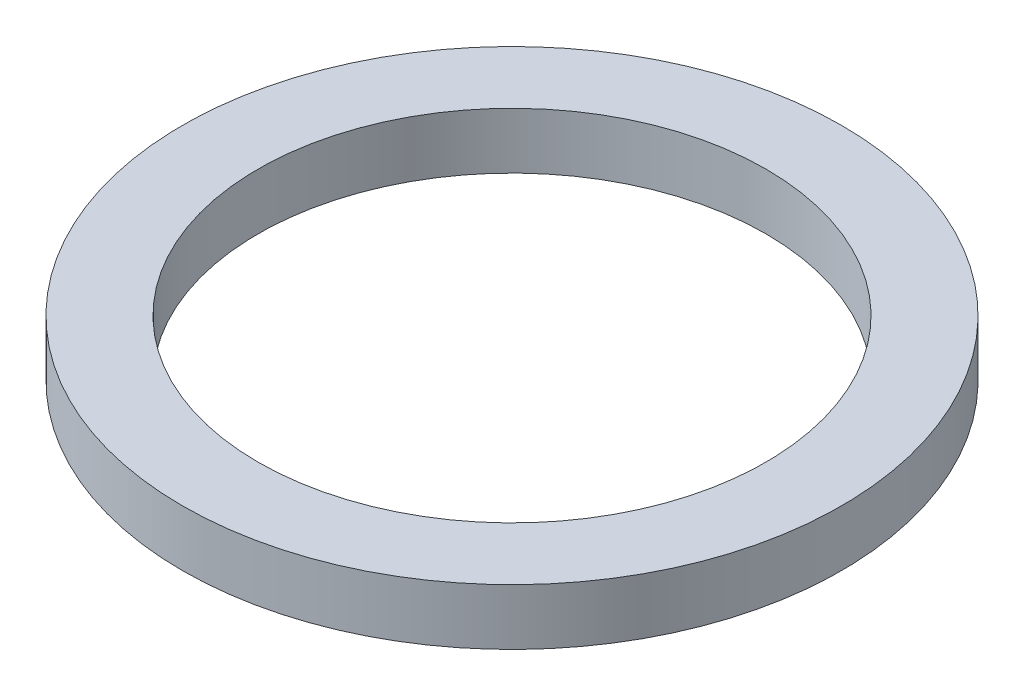
ISO-10303-21;
HEADER;
FILE_DESCRIPTION(('STEP AP214'),'2;1');
FILE_NAME('part.step','',(''),(''),'','','');
FILE_SCHEMA(('AUTOMOTIVE_DESIGN { 1 0 10303 214 1 1 1 1 }'));
ENDSEC;
DATA;
#1=APPLICATION_CONTEXT('core data for automotive mechanical design processes');
#2=APPLICATION_PROTOCOL_DEFINITION('international standard','automotive_design',2000,#1);
#3=PRODUCT_CONTEXT('',#1,'mechanical');
#4=PRODUCT('Part','Part','',(#3));
#5=PRODUCT_RELATED_PRODUCT_CATEGORY('part','',(#4));
#6=PRODUCT_DEFINITION_FORMATION('','',#4);
#7=PRODUCT_DEFINITION_CONTEXT('part definition',#1,'design');
#8=PRODUCT_DEFINITION('design','',#6,#7);
#9=PRODUCT_DEFINITION_SHAPE('','',#8);
#10=(LENGTH_UNIT() NAMED_UNIT(*) SI_UNIT(.MILLI.,.METRE.));
#11=(NAMED_UNIT(*) PLANE_ANGLE_UNIT() SI_UNIT($,.RADIAN.));
#12=(NAMED_UNIT(*) SI_UNIT($,.STERADIAN.) SOLID_ANGLE_UNIT());
#13=UNCERTAINTY_MEASURE_WITH_UNIT(LENGTH_MEASURE(1.E-05),#10,'distance_accuracy_value','');
#14=(GEOMETRIC_REPRESENTATION_CONTEXT(3) GLOBAL_UNCERTAINTY_ASSIGNED_CONTEXT((#13)) GLOBAL_UNIT_ASSIGNED_CONTEXT((#10,
#11,#12)) REPRESENTATION_CONTEXT('',''));
#15=CARTESIAN_POINT('',(0.,0.,0.));
#16=DIRECTION('',(0.,0.,1.));
#17=DIRECTION('',(1.,0.,0.));
#18=AXIS2_PLACEMENT_3D('',#15,#16,#17);
#19=CARTESIAN_POINT('',(0.,6.35,0.));
#20=DIRECTION('',(0.,1.,0.));
#21=DIRECTION('',(0.,0.,1.));
#22=AXIS2_PLACEMENT_3D('',#19,#20,#21);
#23=PLANE('',#22);
#24=CARTESIAN_POINT('',(0.,6.35,0.));
#25=DIRECTION('',(0.,1.,0.));
#26=DIRECTION('',(0.,0.,1.));
#27=AXIS2_PLACEMENT_3D('',#24,#25,#26);
#28=CIRCLE('',#27,37.2872);
#29=CARTESIAN_POINT('',(0.,6.35,37.2872));
#30=VERTEX_POINT('',#29);
#31=EDGE_CURVE('E10',#30,#30,#28,.T.);
#32=ORIENTED_EDGE('',*,*,#31,.T.);
#33=EDGE_LOOP('',(#32));
#34=FACE_BOUND('',#33,.T.);
#35=CARTESIAN_POINT('',(0.,6.35,0.));
#36=DIRECTION('',(0.,1.,0.));
#37=DIRECTION('',(0.,0.,1.));
#38=AXIS2_PLACEMENT_3D('',#35,#36,#37);
#39=CIRCLE('',#38,28.7274);
#40=CARTESIAN_POINT('',(0.,6.35,28.7274));
#41=VERTEX_POINT('',#40);
#42=EDGE_CURVE('E50',#41,#41,#39,.T.);
#43=ORIENTED_EDGE('',*,*,#42,.F.);
#44=EDGE_LOOP('',(#43));
#45=FACE_BOUND('',#44,.T.);
#46=ADVANCED_FACE('F37',(#34,#45),#23,.T.);
#47=CARTESIAN_POINT('',(0.,0.,0.));
#48=DIRECTION('',(0.,1.,0.));
#49=DIRECTION('',(0.,0.,1.));
#50=AXIS2_PLACEMENT_3D('',#47,#48,#49);
#51=PLANE('',#50);
#52=CARTESIAN_POINT('',(0.,0.,0.));
#53=DIRECTION('',(0.,1.,0.));
#54=DIRECTION('',(0.,0.,1.));
#55=AXIS2_PLACEMENT_3D('',#52,#53,#54);
#56=CIRCLE('',#55,37.2872);
#57=CARTESIAN_POINT('',(0.,0.,37.2872));
#58=VERTEX_POINT('',#57);
#59=EDGE_CURVE('E41',#58,#58,#56,.T.);
#60=ORIENTED_EDGE('',*,*,#59,.F.);
#61=EDGE_LOOP('',(#60));
#62=FACE_BOUND('',#61,.T.);
#63=CARTESIAN_POINT('',(0.,0.,0.));
#64=DIRECTION('',(0.,1.,0.));
#65=DIRECTION('',(0.,0.,1.));
#66=AXIS2_PLACEMENT_3D('',#63,#64,#65);
#67=CIRCLE('',#66,28.7274);
#68=CARTESIAN_POINT('',(0.,0.,28.7274));
#69=VERTEX_POINT('',#68);
#70=EDGE_CURVE('E52',#69,#69,#67,.T.);
#71=ORIENTED_EDGE('',*,*,#70,.T.);
#72=EDGE_LOOP('',(#71));
#73=FACE_BOUND('',#72,.T.);
#74=ADVANCED_FACE('F64',(#62,#73),#51,.F.);
#75=CARTESIAN_POINT('',(0.,6.35,0.));
#76=DIRECTION('',(0.,-1.,0.));
#77=DIRECTION('',(0.,0.,-1.));
#78=AXIS2_PLACEMENT_3D('',#75,#76,#77);
#79=CYLINDRICAL_SURFACE('',#78,37.2872);
#80=ORIENTED_EDGE('',*,*,#31,.F.);
#81=EDGE_LOOP('',(#80));
#82=FACE_BOUND('',#81,.T.);
#83=ORIENTED_EDGE('',*,*,#59,.T.);
#84=EDGE_LOOP('',(#83));
#85=FACE_BOUND('',#84,.T.);
#86=ADVANCED_FACE('F39',(#82,#85),#79,.T.);
#87=CARTESIAN_POINT('',(0.,6.35,0.));
#88=DIRECTION('',(0.,-1.,0.));
#89=DIRECTION('',(0.,0.,-1.));
#90=AXIS2_PLACEMENT_3D('',#87,#88,#89);
#91=CYLINDRICAL_SURFACE('',#90,28.7274);
#92=ORIENTED_EDGE('',*,*,#42,.T.);
#93=EDGE_LOOP('',(#92));
#94=FACE_BOUND('',#93,.T.);
#95=ORIENTED_EDGE('',*,*,#70,.F.);
#96=EDGE_LOOP('',(#95));
#97=FACE_BOUND('',#96,.T.);
#98=ADVANCED_FACE('F60',(#94,#97),#91,.F.);
#99=CLOSED_SHELL('',(#46,#74,#86,#98));
#100=MANIFOLD_SOLID_BREP('B2',#99);
#101=ADVANCED_BREP_SHAPE_REPRESENTATION('',(#18,#100),#14);
#102=SHAPE_DEFINITION_REPRESENTATION(#9,#101);
ENDSEC;
END-ISO-10303-21;
